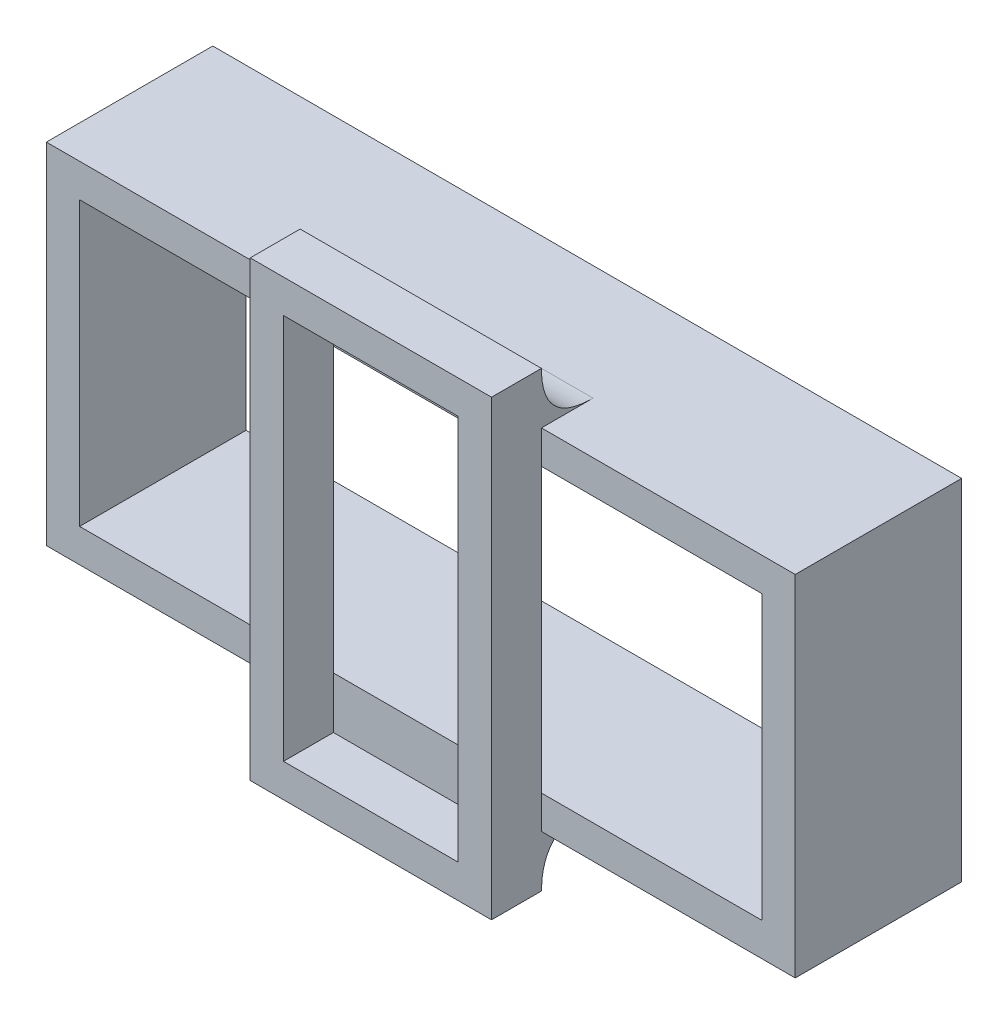
ISO-10303-21;
HEADER;
FILE_DESCRIPTION(('STEP AP214'),'2;1');
FILE_NAME('part.step','',(''),(''),'','','');
FILE_SCHEMA(('AUTOMOTIVE_DESIGN { 1 0 10303 214 1 1 1 1 }'));
ENDSEC;
DATA;
#1=APPLICATION_CONTEXT('core data for automotive mechanical design processes');
#2=APPLICATION_PROTOCOL_DEFINITION('international standard','automotive_design',2000,#1);
#3=PRODUCT_CONTEXT('',#1,'mechanical');
#4=PRODUCT('Part','Part','',(#3));
#5=PRODUCT_RELATED_PRODUCT_CATEGORY('part','',(#4));
#6=PRODUCT_DEFINITION_FORMATION('','',#4);
#7=PRODUCT_DEFINITION_CONTEXT('part definition',#1,'design');
#8=PRODUCT_DEFINITION('design','',#6,#7);
#9=PRODUCT_DEFINITION_SHAPE('','',#8);
#10=(LENGTH_UNIT() NAMED_UNIT(*) SI_UNIT(.MILLI.,.METRE.));
#11=(NAMED_UNIT(*) PLANE_ANGLE_UNIT() SI_UNIT($,.RADIAN.));
#12=(NAMED_UNIT(*) SI_UNIT($,.STERADIAN.) SOLID_ANGLE_UNIT());
#13=UNCERTAINTY_MEASURE_WITH_UNIT(LENGTH_MEASURE(1.E-05),#10,'distance_accuracy_value','');
#14=(GEOMETRIC_REPRESENTATION_CONTEXT(3) GLOBAL_UNCERTAINTY_ASSIGNED_CONTEXT((#13)) GLOBAL_UNIT_ASSIGNED_CONTEXT((#10,
#11,#12)) REPRESENTATION_CONTEXT('',''));
#15=CARTESIAN_POINT('',(0.,0.,0.));
#16=DIRECTION('',(0.,0.,1.));
#17=DIRECTION('',(1.,0.,0.));
#18=AXIS2_PLACEMENT_3D('',#15,#16,#17);
#19=CARTESIAN_POINT('',(-3.74554709729617,30.681022193975,10.));
#20=DIRECTION('',(0.,1.,0.));
#21=DIRECTION('',(0.,0.,1.));
#22=AXIS2_PLACEMENT_3D('',#19,#20,#21);
#23=PLANE('',#22);
#24=DIRECTION('',(0.,0.,1.));
#25=VECTOR('',#24,1.);
#26=CARTESIAN_POINT('',(11.5044529027039,30.681022193975,10.));
#27=LINE('',#26,#25);
#28=CARTESIAN_POINT('',(11.5044529027039,30.681022193975,6.90000000000001));
#29=VERTEX_POINT('',#28);
#30=CARTESIAN_POINT('',(11.5044529027039,30.681022193975,10.));
#31=VERTEX_POINT('',#30);
#32=EDGE_CURVE('E583',#29,#31,#27,.T.);
#33=ORIENTED_EDGE('',*,*,#32,.T.);
#34=DIRECTION('',(1.,0.,0.));
#35=VECTOR('',#34,1.);
#36=CARTESIAN_POINT('',(-3.74554709729617,30.681022193975,10.));
#37=LINE('',#36,#35);
#38=CARTESIAN_POINT('',(-3.74554709729617,30.681022193975,10.));
#39=VERTEX_POINT('',#38);
#40=EDGE_CURVE('E235',#39,#31,#37,.T.);
#41=ORIENTED_EDGE('',*,*,#40,.F.);
#42=DIRECTION('',(0.,0.,-1.));
#43=VECTOR('',#42,1.);
#44=CARTESIAN_POINT('',(-3.74554709729617,30.681022193975,10.));
#45=LINE('',#44,#43);
#46=CARTESIAN_POINT('',(-3.74554709729617,30.681022193975,0.));
#47=VERTEX_POINT('',#46);
#48=EDGE_CURVE('E262',#39,#47,#45,.T.);
#49=ORIENTED_EDGE('',*,*,#48,.T.);
#50=DIRECTION('',(1.,0.,0.));
#51=VECTOR('',#50,1.);
#52=CARTESIAN_POINT('',(-3.74554709729617,30.681022193975,0.));
#53=LINE('',#52,#51);
#54=CARTESIAN_POINT('',(41.2544529027038,30.681022193975,0.));
#55=VERTEX_POINT('',#54);
#56=EDGE_CURVE('E256',#47,#55,#53,.T.);
#57=ORIENTED_EDGE('',*,*,#56,.T.);
#58=DIRECTION('',(0.,0.,-1.));
#59=VECTOR('',#58,1.);
#60=CARTESIAN_POINT('',(41.2544529027038,30.681022193975,10.));
#61=LINE('',#60,#59);
#62=CARTESIAN_POINT('',(41.2544529027038,30.681022193975,10.));
#63=VERTEX_POINT('',#62);
#64=EDGE_CURVE('E232',#63,#55,#61,.T.);
#65=ORIENTED_EDGE('',*,*,#64,.F.);
#66=CARTESIAN_POINT('',(26.0044529027039,30.681022193975,10.));
#67=VERTEX_POINT('',#66);
#68=EDGE_CURVE('E226',#67,#63,#37,.T.);
#69=ORIENTED_EDGE('',*,*,#68,.F.);
#70=DIRECTION('',(0.,0.,1.));
#71=VECTOR('',#70,1.);
#72=CARTESIAN_POINT('',(26.0044529027039,30.681022193975,10.));
#73=LINE('',#72,#71);
#74=CARTESIAN_POINT('',(26.0044529027039,30.681022193975,6.90000000000001));
#75=VERTEX_POINT('',#74);
#76=EDGE_CURVE('E210',#75,#67,#73,.T.);
#77=ORIENTED_EDGE('',*,*,#76,.F.);
#78=DIRECTION('',(1.,0.,0.));
#79=VECTOR('',#78,1.);
#80=CARTESIAN_POINT('',(11.5044529027039,30.681022193975,6.90000000000001));
#81=LINE('',#80,#79);
#82=EDGE_CURVE('E586',#29,#75,#81,.T.);
#83=ORIENTED_EDGE('',*,*,#82,.F.);
#84=EDGE_LOOP('',(#33,#41,#49,#57,#65,#69,#77,#83));
#85=FACE_BOUND('',#84,.T.);
#86=ADVANCED_FACE('F45',(#85),#23,.F.);
#87=CARTESIAN_POINT('',(-3.74554709729617,51.681022193975,10.));
#88=DIRECTION('',(0.,-1.,0.));
#89=DIRECTION('',(0.,0.,-1.));
#90=AXIS2_PLACEMENT_3D('',#87,#88,#89);
#91=PLANE('',#90);
#92=DIRECTION('',(0.,0.,-1.));
#93=VECTOR('',#92,1.);
#94=CARTESIAN_POINT('',(11.5044529027039,51.681022193975,10.));
#95=LINE('',#94,#93);
#96=CARTESIAN_POINT('',(11.5044529027039,51.681022193975,10.));
#97=VERTEX_POINT('',#96);
#98=CARTESIAN_POINT('',(11.5044529027039,51.681022193975,6.90000000000001));
#99=VERTEX_POINT('',#98);
#100=EDGE_CURVE('E320',#97,#99,#95,.T.);
#101=ORIENTED_EDGE('',*,*,#100,.T.);
#102=DIRECTION('',(1.,0.,0.));
#103=VECTOR('',#102,1.);
#104=CARTESIAN_POINT('',(11.5044529027039,51.681022193975,6.90000000000001));
#105=LINE('',#104,#103);
#106=CARTESIAN_POINT('',(26.0044529027039,51.681022193975,6.90000000000001));
#107=VERTEX_POINT('',#106);
#108=EDGE_CURVE('E300',#99,#107,#105,.T.);
#109=ORIENTED_EDGE('',*,*,#108,.T.);
#110=DIRECTION('',(0.,0.,-1.));
#111=VECTOR('',#110,1.);
#112=CARTESIAN_POINT('',(26.0044529027039,51.681022193975,10.));
#113=LINE('',#112,#111);
#114=CARTESIAN_POINT('',(26.0044529027039,51.681022193975,10.));
#115=VERTEX_POINT('',#114);
#116=EDGE_CURVE('E321',#115,#107,#113,.T.);
#117=ORIENTED_EDGE('',*,*,#116,.F.);
#118=DIRECTION('',(-1.,0.,0.));
#119=VECTOR('',#118,1.);
#120=CARTESIAN_POINT('',(-3.74554709729617,51.681022193975,10.));
#121=LINE('',#120,#119);
#122=CARTESIAN_POINT('',(41.2544529027038,51.681022193975,10.));
#123=VERTEX_POINT('',#122);
#124=EDGE_CURVE('E241',#123,#115,#121,.T.);
#125=ORIENTED_EDGE('',*,*,#124,.F.);
#126=DIRECTION('',(0.,0.,-1.));
#127=VECTOR('',#126,1.);
#128=CARTESIAN_POINT('',(41.2544529027038,51.681022193975,10.));
#129=LINE('',#128,#127);
#130=CARTESIAN_POINT('',(41.2544529027038,51.681022193975,0.));
#131=VERTEX_POINT('',#130);
#132=EDGE_CURVE('E49',#123,#131,#129,.T.);
#133=ORIENTED_EDGE('',*,*,#132,.T.);
#134=DIRECTION('',(-1.,0.,0.));
#135=VECTOR('',#134,1.);
#136=CARTESIAN_POINT('',(-3.74554709729617,51.681022193975,0.));
#137=LINE('',#136,#135);
#138=CARTESIAN_POINT('',(-3.74554709729617,51.681022193975,0.));
#139=VERTEX_POINT('',#138);
#140=EDGE_CURVE('E249',#131,#139,#137,.T.);
#141=ORIENTED_EDGE('',*,*,#140,.T.);
#142=DIRECTION('',(0.,0.,-1.));
#143=VECTOR('',#142,1.);
#144=CARTESIAN_POINT('',(-3.74554709729617,51.681022193975,10.));
#145=LINE('',#144,#143);
#146=CARTESIAN_POINT('',(-3.74554709729617,51.681022193975,10.));
#147=VERTEX_POINT('',#146);
#148=EDGE_CURVE('E265',#147,#139,#145,.T.);
#149=ORIENTED_EDGE('',*,*,#148,.F.);
#150=EDGE_CURVE('E428',#97,#147,#121,.T.);
#151=ORIENTED_EDGE('',*,*,#150,.F.);
#152=EDGE_LOOP('',(#101,#109,#117,#125,#133,#141,#149,#151));
#153=FACE_BOUND('',#152,.T.);
#154=ADVANCED_FACE('F420',(#153),#91,.F.);
#155=CARTESIAN_POINT('',(0.,0.,10.));
#156=DIRECTION('',(0.,0.,-1.));
#157=DIRECTION('',(-1.,0.,0.));
#158=AXIS2_PLACEMENT_3D('',#155,#156,#157);
#159=PLANE('',#158);
#160=DIRECTION('',(0.,1.,0.));
#161=VECTOR('',#160,1.);
#162=CARTESIAN_POINT('',(26.0044529027039,27.581022193975,10.));
#163=LINE('',#162,#161);
#164=CARTESIAN_POINT('',(26.0044529027039,32.681022193975,10.));
#165=VERTEX_POINT('',#164);
#166=EDGE_CURVE('E11',#67,#165,#163,.T.);
#167=ORIENTED_EDGE('',*,*,#166,.F.);
#168=ORIENTED_EDGE('',*,*,#68,.T.);
#169=DIRECTION('',(0.,1.,0.));
#170=VECTOR('',#169,1.);
#171=CARTESIAN_POINT('',(41.2544529027038,30.681022193975,10.));
#172=LINE('',#171,#170);
#173=EDGE_CURVE('E259',#63,#123,#172,.T.);
#174=ORIENTED_EDGE('',*,*,#173,.T.);
#175=ORIENTED_EDGE('',*,*,#124,.T.);
#176=CARTESIAN_POINT('',(26.0044529027039,49.681022193975,10.));
#177=VERTEX_POINT('',#176);
#178=EDGE_CURVE('E55',#177,#115,#163,.T.);
#179=ORIENTED_EDGE('',*,*,#178,.F.);
#180=DIRECTION('',(-1.,0.,0.));
#181=VECTOR('',#180,1.);
#182=CARTESIAN_POINT('',(39.2544529027038,49.681022193975,10.));
#183=LINE('',#182,#181);
#184=CARTESIAN_POINT('',(39.2544529027038,49.681022193975,10.));
#185=VERTEX_POINT('',#184);
#186=EDGE_CURVE('E556',#185,#177,#183,.T.);
#187=ORIENTED_EDGE('',*,*,#186,.F.);
#188=DIRECTION('',(0.,1.,0.));
#189=VECTOR('',#188,1.);
#190=CARTESIAN_POINT('',(39.2544529027038,49.681022193975,10.));
#191=LINE('',#190,#189);
#192=CARTESIAN_POINT('',(39.2544529027038,32.681022193975,10.));
#193=VERTEX_POINT('',#192);
#194=EDGE_CURVE('E530',#193,#185,#191,.T.);
#195=ORIENTED_EDGE('',*,*,#194,.F.);
#196=DIRECTION('',(1.,0.,0.));
#197=VECTOR('',#196,1.);
#198=CARTESIAN_POINT('',(39.2544529027038,32.681022193975,10.));
#199=LINE('',#198,#197);
#200=EDGE_CURVE('E229',#165,#193,#199,.T.);
#201=ORIENTED_EDGE('',*,*,#200,.F.);
#202=EDGE_LOOP('',(#167,#168,#174,#175,#179,#187,#195,#201));
#203=FACE_BOUND('',#202,.T.);
#204=ADVANCED_FACE('F224',(#203),#159,.F.);
#205=DIRECTION('',(0.,-1.,0.));
#206=VECTOR('',#205,1.);
#207=CARTESIAN_POINT('',(11.5044529027039,27.581022193975,10.));
#208=LINE('',#207,#206);
#209=CARTESIAN_POINT('',(11.5044529027039,49.681022193975,10.));
#210=VERTEX_POINT('',#209);
#211=EDGE_CURVE('E434',#97,#210,#208,.T.);
#212=ORIENTED_EDGE('',*,*,#211,.F.);
#213=ORIENTED_EDGE('',*,*,#150,.T.);
#214=DIRECTION('',(0.,-1.,0.));
#215=VECTOR('',#214,1.);
#216=CARTESIAN_POINT('',(-3.74554709729617,30.681022193975,10.));
#217=LINE('',#216,#215);
#218=EDGE_CURVE('E236',#147,#39,#217,.T.);
#219=ORIENTED_EDGE('',*,*,#218,.T.);
#220=ORIENTED_EDGE('',*,*,#40,.T.);
#221=CARTESIAN_POINT('',(11.5044529027039,32.681022193975,10.));
#222=VERTEX_POINT('',#221);
#223=EDGE_CURVE('E441',#222,#31,#208,.T.);
#224=ORIENTED_EDGE('',*,*,#223,.F.);
#225=CARTESIAN_POINT('',(-1.74554709729616,32.681022193975,10.));
#226=VERTEX_POINT('',#225);
#227=EDGE_CURVE('E506',#226,#222,#199,.T.);
#228=ORIENTED_EDGE('',*,*,#227,.F.);
#229=DIRECTION('',(0.,-1.,0.));
#230=VECTOR('',#229,1.);
#231=CARTESIAN_POINT('',(-1.74554709729617,49.681022193975,10.));
#232=LINE('',#231,#230);
#233=CARTESIAN_POINT('',(-1.74554709729617,49.681022193975,10.));
#234=VERTEX_POINT('',#233);
#235=EDGE_CURVE('E511',#234,#226,#232,.T.);
#236=ORIENTED_EDGE('',*,*,#235,.F.);
#237=EDGE_CURVE('E438',#210,#234,#183,.T.);
#238=ORIENTED_EDGE('',*,*,#237,.F.);
#239=EDGE_LOOP('',(#212,#213,#219,#220,#224,#228,#236,#238));
#240=FACE_BOUND('',#239,.T.);
#241=ADVANCED_FACE('F426',(#240),#159,.F.);
#242=DIRECTION('',(0.,-1.,0.));
#243=VECTOR('',#242,1.);
#244=CARTESIAN_POINT('',(13.5044529027039,29.581022193975,10.));
#245=LINE('',#244,#243);
#246=CARTESIAN_POINT('',(13.5044529027039,32.681022193975,10.));
#247=VERTEX_POINT('',#246);
#248=CARTESIAN_POINT('',(13.5044529027039,29.581022193975,10.));
#249=VERTEX_POINT('',#248);
#250=EDGE_CURVE('E274',#247,#249,#245,.T.);
#251=ORIENTED_EDGE('',*,*,#250,.T.);
#252=DIRECTION('',(1.,0.,0.));
#253=VECTOR('',#252,1.);
#254=CARTESIAN_POINT('',(13.5044529027039,29.581022193975,10.));
#255=LINE('',#254,#253);
#256=CARTESIAN_POINT('',(24.0044529027039,29.581022193975,10.));
#257=VERTEX_POINT('',#256);
#258=EDGE_CURVE('E290',#249,#257,#255,.T.);
#259=ORIENTED_EDGE('',*,*,#258,.T.);
#260=DIRECTION('',(0.,1.,0.));
#261=VECTOR('',#260,1.);
#262=CARTESIAN_POINT('',(24.0044529027039,29.581022193975,10.));
#263=LINE('',#262,#261);
#264=CARTESIAN_POINT('',(24.0044529027039,32.681022193975,10.));
#265=VERTEX_POINT('',#264);
#266=EDGE_CURVE('E302',#257,#265,#263,.T.);
#267=ORIENTED_EDGE('',*,*,#266,.T.);
#268=EDGE_CURVE('E495',#247,#265,#199,.T.);
#269=ORIENTED_EDGE('',*,*,#268,.F.);
#270=EDGE_LOOP('',(#251,#259,#267,#269));
#271=FACE_BOUND('',#270,.T.);
#272=ADVANCED_FACE('F414',(#271),#159,.F.);
#273=CARTESIAN_POINT('',(24.0044529027039,49.681022193975,10.));
#274=VERTEX_POINT('',#273);
#275=CARTESIAN_POINT('',(13.5044529027039,49.681022193975,10.));
#276=VERTEX_POINT('',#275);
#277=EDGE_CURVE('E557',#274,#276,#183,.T.);
#278=ORIENTED_EDGE('',*,*,#277,.F.);
#279=CARTESIAN_POINT('',(24.0044529027039,52.781022193975,10.));
#280=VERTEX_POINT('',#279);
#281=EDGE_CURVE('E286',#274,#280,#263,.T.);
#282=ORIENTED_EDGE('',*,*,#281,.T.);
#283=DIRECTION('',(-1.,0.,0.));
#284=VECTOR('',#283,1.);
#285=CARTESIAN_POINT('',(13.5044529027039,52.781022193975,10.));
#286=LINE('',#285,#284);
#287=CARTESIAN_POINT('',(13.5044529027039,52.781022193975,10.));
#288=VERTEX_POINT('',#287);
#289=EDGE_CURVE('E291',#280,#288,#286,.T.);
#290=ORIENTED_EDGE('',*,*,#289,.T.);
#291=EDGE_CURVE('E278',#288,#276,#245,.T.);
#292=ORIENTED_EDGE('',*,*,#291,.T.);
#293=EDGE_LOOP('',(#278,#282,#290,#292));
#294=FACE_BOUND('',#293,.T.);
#295=ADVANCED_FACE('F410',(#294),#159,.F.);
#296=CARTESIAN_POINT('',(0.,0.,0.));
#297=DIRECTION('',(0.,0.,-1.));
#298=DIRECTION('',(-1.,0.,0.));
#299=AXIS2_PLACEMENT_3D('',#296,#297,#298);
#300=PLANE('',#299);
#301=DIRECTION('',(0.,1.,0.));
#302=VECTOR('',#301,1.);
#303=CARTESIAN_POINT('',(41.2544529027038,30.681022193975,0.));
#304=LINE('',#303,#302);
#305=EDGE_CURVE('E245',#55,#131,#304,.T.);
#306=ORIENTED_EDGE('',*,*,#305,.F.);
#307=ORIENTED_EDGE('',*,*,#56,.F.);
#308=DIRECTION('',(0.,-1.,0.));
#309=VECTOR('',#308,1.);
#310=CARTESIAN_POINT('',(-3.74554709729617,30.681022193975,0.));
#311=LINE('',#310,#309);
#312=EDGE_CURVE('E253',#139,#47,#311,.T.);
#313=ORIENTED_EDGE('',*,*,#312,.F.);
#314=ORIENTED_EDGE('',*,*,#140,.F.);
#315=EDGE_LOOP('',(#306,#307,#313,#314));
#316=FACE_BOUND('',#315,.T.);
#317=DIRECTION('',(1.,0.,0.));
#318=VECTOR('',#317,1.);
#319=CARTESIAN_POINT('',(39.2544529027038,32.681022193975,0.));
#320=LINE('',#319,#318);
#321=CARTESIAN_POINT('',(-1.74554709729616,32.681022193975,0.));
#322=VERTEX_POINT('',#321);
#323=CARTESIAN_POINT('',(39.2544529027038,32.681022193975,0.));
#324=VERTEX_POINT('',#323);
#325=EDGE_CURVE('E526',#322,#324,#320,.T.);
#326=ORIENTED_EDGE('',*,*,#325,.T.);
#327=DIRECTION('',(0.,1.,0.));
#328=VECTOR('',#327,1.);
#329=CARTESIAN_POINT('',(39.2544529027038,49.681022193975,0.));
#330=LINE('',#329,#328);
#331=CARTESIAN_POINT('',(39.2544529027038,49.681022193975,0.));
#332=VERTEX_POINT('',#331);
#333=EDGE_CURVE('E513',#324,#332,#330,.T.);
#334=ORIENTED_EDGE('',*,*,#333,.T.);
#335=DIRECTION('',(-1.,0.,0.));
#336=VECTOR('',#335,1.);
#337=CARTESIAN_POINT('',(39.2544529027038,49.681022193975,0.));
#338=LINE('',#337,#336);
#339=CARTESIAN_POINT('',(-1.74554709729617,49.681022193975,0.));
#340=VERTEX_POINT('',#339);
#341=EDGE_CURVE('E517',#332,#340,#338,.T.);
#342=ORIENTED_EDGE('',*,*,#341,.T.);
#343=DIRECTION('',(0.,-1.,0.));
#344=VECTOR('',#343,1.);
#345=CARTESIAN_POINT('',(-1.74554709729617,49.681022193975,0.));
#346=LINE('',#345,#344);
#347=EDGE_CURVE('E522',#340,#322,#346,.T.);
#348=ORIENTED_EDGE('',*,*,#347,.T.);
#349=EDGE_LOOP('',(#326,#334,#342,#348));
#350=FACE_BOUND('',#349,.T.);
#351=ADVANCED_FACE('F413',(#316,#350),#300,.T.);
#352=CARTESIAN_POINT('',(41.2544529027038,30.681022193975,10.));
#353=DIRECTION('',(-1.,0.,0.));
#354=DIRECTION('',(0.,0.,1.));
#355=AXIS2_PLACEMENT_3D('',#352,#353,#354);
#356=PLANE('',#355);
#357=ORIENTED_EDGE('',*,*,#305,.T.);
#358=ORIENTED_EDGE('',*,*,#132,.F.);
#359=ORIENTED_EDGE('',*,*,#173,.F.);
#360=ORIENTED_EDGE('',*,*,#64,.T.);
#361=EDGE_LOOP('',(#357,#358,#359,#360));
#362=FACE_BOUND('',#361,.T.);
#363=ADVANCED_FACE('F47',(#362),#356,.F.);
#364=CARTESIAN_POINT('',(-3.74554709729617,30.681022193975,10.));
#365=DIRECTION('',(1.,0.,0.));
#366=DIRECTION('',(0.,0.,-1.));
#367=AXIS2_PLACEMENT_3D('',#364,#365,#366);
#368=PLANE('',#367);
#369=ORIENTED_EDGE('',*,*,#312,.T.);
#370=ORIENTED_EDGE('',*,*,#48,.F.);
#371=ORIENTED_EDGE('',*,*,#218,.F.);
#372=ORIENTED_EDGE('',*,*,#148,.T.);
#373=EDGE_LOOP('',(#369,#370,#371,#372));
#374=FACE_BOUND('',#373,.T.);
#375=ADVANCED_FACE('F408',(#374),#368,.F.);
#376=CARTESIAN_POINT('',(39.2544529027038,49.681022193975,10.));
#377=DIRECTION('',(-1.,0.,0.));
#378=DIRECTION('',(0.,0.,1.));
#379=AXIS2_PLACEMENT_3D('',#376,#377,#378);
#380=PLANE('',#379);
#381=ORIENTED_EDGE('',*,*,#333,.F.);
#382=DIRECTION('',(0.,0.,-1.));
#383=VECTOR('',#382,1.);
#384=CARTESIAN_POINT('',(39.2544529027038,32.681022193975,10.));
#385=LINE('',#384,#383);
#386=EDGE_CURVE('E510',#193,#324,#385,.T.);
#387=ORIENTED_EDGE('',*,*,#386,.F.);
#388=ORIENTED_EDGE('',*,*,#194,.T.);
#389=DIRECTION('',(0.,0.,-1.));
#390=VECTOR('',#389,1.);
#391=CARTESIAN_POINT('',(39.2544529027038,49.681022193975,10.));
#392=LINE('',#391,#390);
#393=EDGE_CURVE('E250',#185,#332,#392,.T.);
#394=ORIENTED_EDGE('',*,*,#393,.T.);
#395=EDGE_LOOP('',(#381,#387,#388,#394));
#396=FACE_BOUND('',#395,.T.);
#397=ADVANCED_FACE('F404',(#396),#380,.T.);
#398=CARTESIAN_POINT('',(39.2544529027038,49.681022193975,10.));
#399=DIRECTION('',(0.,-1.,0.));
#400=DIRECTION('',(1.,0.,0.));
#401=AXIS2_PLACEMENT_3D('',#398,#399,#400);
#402=PLANE('',#401);
#403=ORIENTED_EDGE('',*,*,#341,.F.);
#404=ORIENTED_EDGE('',*,*,#393,.F.);
#405=ORIENTED_EDGE('',*,*,#186,.T.);
#406=EDGE_CURVE('E552',#177,#274,#183,.T.);
#407=ORIENTED_EDGE('',*,*,#406,.T.);
#408=ORIENTED_EDGE('',*,*,#277,.T.);
#409=EDGE_CURVE('E560',#276,#210,#183,.T.);
#410=ORIENTED_EDGE('',*,*,#409,.T.);
#411=ORIENTED_EDGE('',*,*,#237,.T.);
#412=DIRECTION('',(0.,0.,-1.));
#413=VECTOR('',#412,1.);
#414=CARTESIAN_POINT('',(-1.74554709729617,49.681022193975,10.));
#415=LINE('',#414,#413);
#416=EDGE_CURVE('E537',#234,#340,#415,.T.);
#417=ORIENTED_EDGE('',*,*,#416,.T.);
#418=EDGE_LOOP('',(#403,#404,#405,#407,#408,#410,#411,#417));
#419=FACE_BOUND('',#418,.T.);
#420=ADVANCED_FACE('F400',(#419),#402,.T.);
#421=CARTESIAN_POINT('',(-1.74554709729617,49.681022193975,10.));
#422=DIRECTION('',(1.,0.,0.));
#423=DIRECTION('',(0.,1.,0.));
#424=AXIS2_PLACEMENT_3D('',#421,#422,#423);
#425=PLANE('',#424);
#426=ORIENTED_EDGE('',*,*,#347,.F.);
#427=ORIENTED_EDGE('',*,*,#416,.F.);
#428=ORIENTED_EDGE('',*,*,#235,.T.);
#429=DIRECTION('',(0.,0.,-1.));
#430=VECTOR('',#429,1.);
#431=CARTESIAN_POINT('',(-1.74554709729616,32.681022193975,10.));
#432=LINE('',#431,#430);
#433=EDGE_CURVE('E534',#226,#322,#432,.T.);
#434=ORIENTED_EDGE('',*,*,#433,.T.);
#435=EDGE_LOOP('',(#426,#427,#428,#434));
#436=FACE_BOUND('',#435,.T.);
#437=ADVANCED_FACE('F396',(#436),#425,.T.);
#438=CARTESIAN_POINT('',(39.2544529027038,32.681022193975,10.));
#439=DIRECTION('',(0.,1.,0.));
#440=DIRECTION('',(-1.,0.,0.));
#441=AXIS2_PLACEMENT_3D('',#438,#439,#440);
#442=PLANE('',#441);
#443=ORIENTED_EDGE('',*,*,#325,.F.);
#444=ORIENTED_EDGE('',*,*,#433,.F.);
#445=ORIENTED_EDGE('',*,*,#227,.T.);
#446=EDGE_CURVE('E501',#222,#247,#199,.T.);
#447=ORIENTED_EDGE('',*,*,#446,.T.);
#448=ORIENTED_EDGE('',*,*,#268,.T.);
#449=EDGE_CURVE('E499',#265,#165,#199,.T.);
#450=ORIENTED_EDGE('',*,*,#449,.T.);
#451=ORIENTED_EDGE('',*,*,#200,.T.);
#452=ORIENTED_EDGE('',*,*,#386,.T.);
#453=EDGE_LOOP('',(#443,#444,#445,#447,#448,#450,#451,#452));
#454=FACE_BOUND('',#453,.T.);
#455=ADVANCED_FACE('F380',(#454),#442,.T.);
#456=CARTESIAN_POINT('',(0.,0.,10.));
#457=DIRECTION('',(0.,0.,-1.));
#458=DIRECTION('',(-1.,0.,0.));
#459=AXIS2_PLACEMENT_3D('',#456,#457,#458);
#460=PLANE('',#459);
#461=ORIENTED_EDGE('',*,*,#446,.F.);
#462=EDGE_CURVE('E443',#210,#222,#208,.T.);
#463=ORIENTED_EDGE('',*,*,#462,.F.);
#464=ORIENTED_EDGE('',*,*,#409,.F.);
#465=EDGE_CURVE('E64',#276,#247,#245,.T.);
#466=ORIENTED_EDGE('',*,*,#465,.T.);
#467=EDGE_LOOP('',(#461,#463,#464,#466));
#468=FACE_BOUND('',#467,.T.);
#469=ADVANCED_FACE('F377',(#468),#460,.T.);
#470=ORIENTED_EDGE('',*,*,#449,.F.);
#471=EDGE_CURVE('E72',#265,#274,#263,.T.);
#472=ORIENTED_EDGE('',*,*,#471,.T.);
#473=ORIENTED_EDGE('',*,*,#406,.F.);
#474=EDGE_CURVE('E57',#165,#177,#163,.T.);
#475=ORIENTED_EDGE('',*,*,#474,.F.);
#476=EDGE_LOOP('',(#470,#472,#473,#475));
#477=FACE_BOUND('',#476,.T.);
#478=ADVANCED_FACE('F375',(#477),#460,.T.);
#479=CARTESIAN_POINT('',(0.,0.,13.));
#480=DIRECTION('',(0.,0.,-1.));
#481=DIRECTION('',(-1.,0.,0.));
#482=AXIS2_PLACEMENT_3D('',#479,#480,#481);
#483=PLANE('',#482);
#484=DIRECTION('',(0.,1.,0.));
#485=VECTOR('',#484,1.);
#486=CARTESIAN_POINT('',(26.0044529027039,27.581022193975,13.));
#487=LINE('',#486,#485);
#488=CARTESIAN_POINT('',(26.0044529027039,27.581022193975,13.));
#489=VERTEX_POINT('',#488);
#490=CARTESIAN_POINT('',(26.0044529027039,54.781022193975,13.));
#491=VERTEX_POINT('',#490);
#492=EDGE_CURVE('E457',#489,#491,#487,.T.);
#493=ORIENTED_EDGE('',*,*,#492,.T.);
#494=DIRECTION('',(-1.,0.,0.));
#495=VECTOR('',#494,1.);
#496=CARTESIAN_POINT('',(11.5044529027039,54.781022193975,13.));
#497=LINE('',#496,#495);
#498=CARTESIAN_POINT('',(11.5044529027039,54.781022193975,13.));
#499=VERTEX_POINT('',#498);
#500=EDGE_CURVE('E471',#491,#499,#497,.T.);
#501=ORIENTED_EDGE('',*,*,#500,.T.);
#502=DIRECTION('',(0.,-1.,0.));
#503=VECTOR('',#502,1.);
#504=CARTESIAN_POINT('',(11.5044529027039,27.581022193975,13.));
#505=LINE('',#504,#503);
#506=CARTESIAN_POINT('',(11.5044529027039,27.581022193975,13.));
#507=VERTEX_POINT('',#506);
#508=EDGE_CURVE('E468',#499,#507,#505,.T.);
#509=ORIENTED_EDGE('',*,*,#508,.T.);
#510=DIRECTION('',(1.,0.,0.));
#511=VECTOR('',#510,1.);
#512=CARTESIAN_POINT('',(11.5044529027039,27.581022193975,13.));
#513=LINE('',#512,#511);
#514=EDGE_CURVE('E464',#507,#489,#513,.T.);
#515=ORIENTED_EDGE('',*,*,#514,.T.);
#516=EDGE_LOOP('',(#493,#501,#509,#515));
#517=FACE_BOUND('',#516,.T.);
#518=DIRECTION('',(0.,1.,0.));
#519=VECTOR('',#518,1.);
#520=CARTESIAN_POINT('',(24.0044529027039,29.581022193975,13.));
#521=LINE('',#520,#519);
#522=CARTESIAN_POINT('',(24.0044529027039,29.581022193975,13.));
#523=VERTEX_POINT('',#522);
#524=CARTESIAN_POINT('',(24.0044529027039,52.781022193975,13.));
#525=VERTEX_POINT('',#524);
#526=EDGE_CURVE('E295',#523,#525,#521,.T.);
#527=ORIENTED_EDGE('',*,*,#526,.F.);
#528=DIRECTION('',(1.,0.,0.));
#529=VECTOR('',#528,1.);
#530=CARTESIAN_POINT('',(13.5044529027039,29.581022193975,13.));
#531=LINE('',#530,#529);
#532=CARTESIAN_POINT('',(13.5044529027039,29.581022193975,13.));
#533=VERTEX_POINT('',#532);
#534=EDGE_CURVE('E304',#533,#523,#531,.T.);
#535=ORIENTED_EDGE('',*,*,#534,.F.);
#536=DIRECTION('',(0.,-1.,0.));
#537=VECTOR('',#536,1.);
#538=CARTESIAN_POINT('',(13.5044529027039,29.581022193975,13.));
#539=LINE('',#538,#537);
#540=CARTESIAN_POINT('',(13.5044529027039,52.781022193975,13.));
#541=VERTEX_POINT('',#540);
#542=EDGE_CURVE('E308',#541,#533,#539,.T.);
#543=ORIENTED_EDGE('',*,*,#542,.F.);
#544=DIRECTION('',(-1.,0.,0.));
#545=VECTOR('',#544,1.);
#546=CARTESIAN_POINT('',(13.5044529027039,52.781022193975,13.));
#547=LINE('',#546,#545);
#548=EDGE_CURVE('E312',#525,#541,#547,.T.);
#549=ORIENTED_EDGE('',*,*,#548,.F.);
#550=EDGE_LOOP('',(#527,#535,#543,#549));
#551=FACE_BOUND('',#550,.T.);
#552=ADVANCED_FACE('F372',(#517,#551),#483,.F.);
#553=CARTESIAN_POINT('',(26.0044529027039,27.581022193975,13.));
#554=DIRECTION('',(-1.,0.,0.));
#555=DIRECTION('',(0.,0.,1.));
#556=AXIS2_PLACEMENT_3D('',#553,#554,#555);
#557=PLANE('',#556);
#558=DIRECTION('',(0.,0.,-1.));
#559=VECTOR('',#558,1.);
#560=CARTESIAN_POINT('',(26.0044529027039,27.581022193975,13.));
#561=LINE('',#560,#559);
#562=CARTESIAN_POINT('',(26.0044529027039,27.581022193975,10.));
#563=VERTEX_POINT('',#562);
#564=EDGE_CURVE('E467',#489,#563,#561,.T.);
#565=ORIENTED_EDGE('',*,*,#564,.T.);
#566=CARTESIAN_POINT('',(26.0044529027039,27.581022193975,10.));
#567=CARTESIAN_POINT('',(26.0044529027039,30.681022193975,10.));
#568=CARTESIAN_POINT('',(26.0044529027039,30.681022193975,6.90000000000001));
#569=B_SPLINE_CURVE_WITH_KNOTS('',2,(#566,#567,#568),.UNSPECIFIED.,.F.,.F.,(3,3),(0.,1.),.UNSPECIFIED.);
#570=EDGE_CURVE('E216',#563,#75,#569,.T.);
#571=ORIENTED_EDGE('',*,*,#570,.T.);
#572=ORIENTED_EDGE('',*,*,#76,.T.);
#573=ORIENTED_EDGE('',*,*,#166,.T.);
#574=ORIENTED_EDGE('',*,*,#474,.T.);
#575=ORIENTED_EDGE('',*,*,#178,.T.);
#576=ORIENTED_EDGE('',*,*,#116,.T.);
#577=CARTESIAN_POINT('',(26.0044529027039,51.681022193975,6.90000000000001));
#578=CARTESIAN_POINT('',(26.0044529027039,51.681022193975,10.));
#579=CARTESIAN_POINT('',(26.0044529027039,54.781022193975,10.));
#580=B_SPLINE_CURVE_WITH_KNOTS('',2,(#577,#578,#579),.UNSPECIFIED.,.F.,.F.,(3,3),(0.,1.),.UNSPECIFIED.);
#581=CARTESIAN_POINT('',(26.0044529027039,54.781022193975,10.));
#582=VERTEX_POINT('',#581);
#583=EDGE_CURVE('E326',#107,#582,#580,.T.);
#584=ORIENTED_EDGE('',*,*,#583,.T.);
#585=DIRECTION('',(0.,0.,-1.));
#586=VECTOR('',#585,1.);
#587=CARTESIAN_POINT('',(26.0044529027039,54.781022193975,13.));
#588=LINE('',#587,#586);
#589=EDGE_CURVE('E518',#491,#582,#588,.T.);
#590=ORIENTED_EDGE('',*,*,#589,.F.);
#591=ORIENTED_EDGE('',*,*,#492,.F.);
#592=EDGE_LOOP('',(#565,#571,#572,#573,#574,#575,#576,#584,#590,#591));
#593=FACE_BOUND('',#592,.T.);
#594=ADVANCED_FACE('F213',(#593),#557,.F.);
#595=CARTESIAN_POINT('',(11.5044529027039,54.781022193975,13.));
#596=DIRECTION('',(0.,-1.,0.));
#597=DIRECTION('',(0.,0.,-1.));
#598=AXIS2_PLACEMENT_3D('',#595,#596,#597);
#599=PLANE('',#598);
#600=DIRECTION('',(-1.,0.,0.));
#601=VECTOR('',#600,1.);
#602=CARTESIAN_POINT('',(11.5044529027039,54.781022193975,10.));
#603=LINE('',#602,#601);
#604=CARTESIAN_POINT('',(11.5044529027039,54.781022193975,10.));
#605=VERTEX_POINT('',#604);
#606=EDGE_CURVE('E452',#582,#605,#603,.T.);
#607=ORIENTED_EDGE('',*,*,#606,.T.);
#608=DIRECTION('',(0.,0.,-1.));
#609=VECTOR('',#608,1.);
#610=CARTESIAN_POINT('',(11.5044529027039,54.781022193975,13.));
#611=LINE('',#610,#609);
#612=EDGE_CURVE('E566',#499,#605,#611,.T.);
#613=ORIENTED_EDGE('',*,*,#612,.F.);
#614=ORIENTED_EDGE('',*,*,#500,.F.);
#615=ORIENTED_EDGE('',*,*,#589,.T.);
#616=EDGE_LOOP('',(#607,#613,#614,#615));
#617=FACE_BOUND('',#616,.T.);
#618=ADVANCED_FACE('F387',(#617),#599,.F.);
#619=CARTESIAN_POINT('',(11.5044529027039,27.581022193975,13.));
#620=DIRECTION('',(1.,0.,0.));
#621=DIRECTION('',(0.,0.,-1.));
#622=AXIS2_PLACEMENT_3D('',#619,#620,#621);
#623=PLANE('',#622);
#624=ORIENTED_EDGE('',*,*,#612,.T.);
#625=CARTESIAN_POINT('',(11.5044529027039,51.681022193975,6.90000000000001));
#626=CARTESIAN_POINT('',(11.5044529027039,51.681022193975,10.));
#627=CARTESIAN_POINT('',(11.5044529027039,54.781022193975,10.));
#628=B_SPLINE_CURVE_WITH_KNOTS('',2,(#625,#626,#627),.UNSPECIFIED.,.F.,.F.,(3,3),(0.,1.),.UNSPECIFIED.);
#629=EDGE_CURVE('E325',#99,#605,#628,.T.);
#630=ORIENTED_EDGE('',*,*,#629,.F.);
#631=ORIENTED_EDGE('',*,*,#100,.F.);
#632=ORIENTED_EDGE('',*,*,#211,.T.);
#633=ORIENTED_EDGE('',*,*,#462,.T.);
#634=ORIENTED_EDGE('',*,*,#223,.T.);
#635=ORIENTED_EDGE('',*,*,#32,.F.);
#636=CARTESIAN_POINT('',(11.5044529027039,27.581022193975,10.));
#637=CARTESIAN_POINT('',(11.5044529027039,30.681022193975,10.));
#638=CARTESIAN_POINT('',(11.5044529027039,30.681022193975,6.90000000000001));
#639=B_SPLINE_CURVE_WITH_KNOTS('',2,(#636,#637,#638),.UNSPECIFIED.,.F.,.F.,(3,3),(0.,1.),.UNSPECIFIED.);
#640=CARTESIAN_POINT('',(11.5044529027039,27.581022193975,10.));
#641=VERTEX_POINT('',#640);
#642=EDGE_CURVE('E221',#641,#29,#639,.T.);
#643=ORIENTED_EDGE('',*,*,#642,.F.);
#644=DIRECTION('',(0.,0.,-1.));
#645=VECTOR('',#644,1.);
#646=CARTESIAN_POINT('',(11.5044529027039,27.581022193975,13.));
#647=LINE('',#646,#645);
#648=EDGE_CURVE('E569',#507,#641,#647,.T.);
#649=ORIENTED_EDGE('',*,*,#648,.F.);
#650=ORIENTED_EDGE('',*,*,#508,.F.);
#651=EDGE_LOOP('',(#624,#630,#631,#632,#633,#634,#635,#643,#649,#650));
#652=FACE_BOUND('',#651,.T.);
#653=ADVANCED_FACE('F383',(#652),#623,.F.);
#654=CARTESIAN_POINT('',(11.5044529027039,27.581022193975,13.));
#655=DIRECTION('',(0.,1.,0.));
#656=DIRECTION('',(0.,0.,1.));
#657=AXIS2_PLACEMENT_3D('',#654,#655,#656);
#658=PLANE('',#657);
#659=DIRECTION('',(1.,0.,0.));
#660=VECTOR('',#659,1.);
#661=CARTESIAN_POINT('',(11.5044529027039,27.581022193975,10.));
#662=LINE('',#661,#660);
#663=EDGE_CURVE('E451',#641,#563,#662,.T.);
#664=ORIENTED_EDGE('',*,*,#663,.T.);
#665=ORIENTED_EDGE('',*,*,#564,.F.);
#666=ORIENTED_EDGE('',*,*,#514,.F.);
#667=ORIENTED_EDGE('',*,*,#648,.T.);
#668=EDGE_LOOP('',(#664,#665,#666,#667));
#669=FACE_BOUND('',#668,.T.);
#670=ADVANCED_FACE('F371',(#669),#658,.F.);
#671=CARTESIAN_POINT('',(24.0044529027039,29.581022193975,13.));
#672=DIRECTION('',(-1.,0.,0.));
#673=DIRECTION('',(0.,0.,1.));
#674=AXIS2_PLACEMENT_3D('',#671,#672,#673);
#675=PLANE('',#674);
#676=ORIENTED_EDGE('',*,*,#266,.F.);
#677=DIRECTION('',(0.,0.,-1.));
#678=VECTOR('',#677,1.);
#679=CARTESIAN_POINT('',(24.0044529027039,29.581022193975,13.));
#680=LINE('',#679,#678);
#681=EDGE_CURVE('E307',#523,#257,#680,.T.);
#682=ORIENTED_EDGE('',*,*,#681,.F.);
#683=ORIENTED_EDGE('',*,*,#526,.T.);
#684=DIRECTION('',(0.,0.,-1.));
#685=VECTOR('',#684,1.);
#686=CARTESIAN_POINT('',(24.0044529027039,52.781022193975,13.));
#687=LINE('',#686,#685);
#688=EDGE_CURVE('E462',#525,#280,#687,.T.);
#689=ORIENTED_EDGE('',*,*,#688,.T.);
#690=ORIENTED_EDGE('',*,*,#281,.F.);
#691=ORIENTED_EDGE('',*,*,#471,.F.);
#692=EDGE_LOOP('',(#676,#682,#683,#689,#690,#691));
#693=FACE_BOUND('',#692,.T.);
#694=ADVANCED_FACE('F367',(#693),#675,.T.);
#695=CARTESIAN_POINT('',(13.5044529027039,52.781022193975,13.));
#696=DIRECTION('',(0.,-1.,0.));
#697=DIRECTION('',(0.,0.,-1.));
#698=AXIS2_PLACEMENT_3D('',#695,#696,#697);
#699=PLANE('',#698);
#700=ORIENTED_EDGE('',*,*,#289,.F.);
#701=ORIENTED_EDGE('',*,*,#688,.F.);
#702=ORIENTED_EDGE('',*,*,#548,.T.);
#703=DIRECTION('',(0.,0.,-1.));
#704=VECTOR('',#703,1.);
#705=CARTESIAN_POINT('',(13.5044529027039,52.781022193975,13.));
#706=LINE('',#705,#704);
#707=EDGE_CURVE('E480',#541,#288,#706,.T.);
#708=ORIENTED_EDGE('',*,*,#707,.T.);
#709=EDGE_LOOP('',(#700,#701,#702,#708));
#710=FACE_BOUND('',#709,.T.);
#711=ADVANCED_FACE('F364',(#710),#699,.T.);
#712=CARTESIAN_POINT('',(13.5044529027039,29.581022193975,13.));
#713=DIRECTION('',(1.,0.,0.));
#714=DIRECTION('',(0.,0.,-1.));
#715=AXIS2_PLACEMENT_3D('',#712,#713,#714);
#716=PLANE('',#715);
#717=ORIENTED_EDGE('',*,*,#291,.F.);
#718=ORIENTED_EDGE('',*,*,#707,.F.);
#719=ORIENTED_EDGE('',*,*,#542,.T.);
#720=DIRECTION('',(0.,0.,-1.));
#721=VECTOR('',#720,1.);
#722=CARTESIAN_POINT('',(13.5044529027039,29.581022193975,13.));
#723=LINE('',#722,#721);
#724=EDGE_CURVE('E484',#533,#249,#723,.T.);
#725=ORIENTED_EDGE('',*,*,#724,.T.);
#726=ORIENTED_EDGE('',*,*,#250,.F.);
#727=ORIENTED_EDGE('',*,*,#465,.F.);
#728=EDGE_LOOP('',(#717,#718,#719,#725,#726,#727));
#729=FACE_BOUND('',#728,.T.);
#730=ADVANCED_FACE('F360',(#729),#716,.T.);
#731=CARTESIAN_POINT('',(13.5044529027039,29.581022193975,13.));
#732=DIRECTION('',(0.,1.,0.));
#733=DIRECTION('',(0.,0.,1.));
#734=AXIS2_PLACEMENT_3D('',#731,#732,#733);
#735=PLANE('',#734);
#736=ORIENTED_EDGE('',*,*,#258,.F.);
#737=ORIENTED_EDGE('',*,*,#724,.F.);
#738=ORIENTED_EDGE('',*,*,#534,.T.);
#739=ORIENTED_EDGE('',*,*,#681,.T.);
#740=EDGE_LOOP('',(#736,#737,#738,#739));
#741=FACE_BOUND('',#740,.T.);
#742=ADVANCED_FACE('F356',(#741),#735,.T.);
#743=DIRECTION('',(1.,0.,0.));
#744=VECTOR('',#743,1.);
#745=SURFACE_OF_LINEAR_EXTRUSION('',#628,#744);
#746=ORIENTED_EDGE('',*,*,#583,.F.);
#747=ORIENTED_EDGE('',*,*,#108,.F.);
#748=ORIENTED_EDGE('',*,*,#629,.T.);
#749=ORIENTED_EDGE('',*,*,#606,.F.);
#750=EDGE_LOOP('',(#746,#747,#748,#749));
#751=FACE_BOUND('',#750,.T.);
#752=ADVANCED_FACE('F351',(#751),#745,.T.);
#753=DIRECTION('',(1.,0.,0.));
#754=VECTOR('',#753,1.);
#755=SURFACE_OF_LINEAR_EXTRUSION('',#639,#754);
#756=ORIENTED_EDGE('',*,*,#570,.F.);
#757=ORIENTED_EDGE('',*,*,#663,.F.);
#758=ORIENTED_EDGE('',*,*,#642,.T.);
#759=ORIENTED_EDGE('',*,*,#82,.T.);
#760=EDGE_LOOP('',(#756,#757,#758,#759));
#761=FACE_BOUND('',#760,.T.);
#762=ADVANCED_FACE('F355',(#761),#755,.T.);
#763=CLOSED_SHELL('',(#86,#154,#204,#241,#272,#295,#351,#363,#375,#397,#420,#437,#455,#469,#478,
#552,#594,#618,#653,#670,#694,#711,#730,#742,#752,#762));
#764=MANIFOLD_SOLID_BREP('B2',#763);
#765=ADVANCED_BREP_SHAPE_REPRESENTATION('',(#18,#764),#14);
#766=SHAPE_DEFINITION_REPRESENTATION(#9,#765);
ENDSEC;
END-ISO-10303-21;
